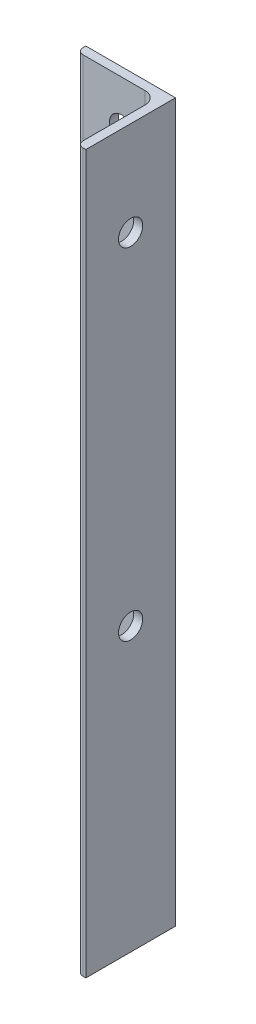
ISO-10303-21;
HEADER;
FILE_DESCRIPTION(('STEP AP214'),'2;1');
FILE_NAME('part.step','',(''),(''),'','','');
FILE_SCHEMA(('AUTOMOTIVE_DESIGN { 1 0 10303 214 1 1 1 1 }'));
ENDSEC;
DATA;
#1=APPLICATION_CONTEXT('core data for automotive mechanical design processes');
#2=APPLICATION_PROTOCOL_DEFINITION('international standard','automotive_design',2000,#1);
#3=PRODUCT_CONTEXT('',#1,'mechanical');
#4=PRODUCT('Part','Part','',(#3));
#5=PRODUCT_RELATED_PRODUCT_CATEGORY('part','',(#4));
#6=PRODUCT_DEFINITION_FORMATION('','',#4);
#7=PRODUCT_DEFINITION_CONTEXT('part definition',#1,'design');
#8=PRODUCT_DEFINITION('design','',#6,#7);
#9=PRODUCT_DEFINITION_SHAPE('','',#8);
#10=(LENGTH_UNIT() NAMED_UNIT(*) SI_UNIT(.MILLI.,.METRE.));
#11=(NAMED_UNIT(*) PLANE_ANGLE_UNIT() SI_UNIT($,.RADIAN.));
#12=(NAMED_UNIT(*) SI_UNIT($,.STERADIAN.) SOLID_ANGLE_UNIT());
#13=UNCERTAINTY_MEASURE_WITH_UNIT(LENGTH_MEASURE(1.E-05),#10,'distance_accuracy_value','');
#14=(GEOMETRIC_REPRESENTATION_CONTEXT(3) GLOBAL_UNCERTAINTY_ASSIGNED_CONTEXT((#13)) GLOBAL_UNIT_ASSIGNED_CONTEXT((#10,
#11,#12)) REPRESENTATION_CONTEXT('',''));
#15=CARTESIAN_POINT('',(0.,0.,0.));
#16=DIRECTION('',(0.,0.,1.));
#17=DIRECTION('',(1.,0.,0.));
#18=AXIS2_PLACEMENT_3D('',#15,#16,#17);
#19=CARTESIAN_POINT('',(0.,200.,0.));
#20=DIRECTION('',(-1.,0.,0.));
#21=DIRECTION('',(0.,0.,1.));
#22=AXIS2_PLACEMENT_3D('',#19,#20,#21);
#23=PLANE('',#22);
#24=CARTESIAN_POINT('',(0.,147.5,25.));
#25=DIRECTION('',(1.,0.,0.));
#26=DIRECTION('',(0.,0.,-1.));
#27=AXIS2_PLACEMENT_3D('',#24,#25,#26);
#28=CIRCLE('',#27,6.75);
#29=CARTESIAN_POINT('',(0.,147.5,18.25));
#30=VERTEX_POINT('',#29);
#31=EDGE_CURVE('E208',#30,#30,#28,.T.);
#32=ORIENTED_EDGE('',*,*,#31,.F.);
#33=EDGE_LOOP('',(#32));
#34=FACE_BOUND('',#33,.T.);
#35=CARTESIAN_POINT('',(0.,-42.5,25.));
#36=DIRECTION('',(1.,0.,0.));
#37=DIRECTION('',(0.,0.,-1.));
#38=AXIS2_PLACEMENT_3D('',#35,#36,#37);
#39=CIRCLE('',#38,6.75);
#40=CARTESIAN_POINT('',(0.,-42.5,18.25));
#41=VERTEX_POINT('',#40);
#42=EDGE_CURVE('E209',#41,#41,#39,.T.);
#43=ORIENTED_EDGE('',*,*,#42,.F.);
#44=EDGE_LOOP('',(#43));
#45=FACE_BOUND('',#44,.T.);
#46=DIRECTION('',(0.,0.,-1.));
#47=VECTOR('',#46,1.);
#48=CARTESIAN_POINT('',(0.,-200.,0.));
#49=LINE('',#48,#47);
#50=CARTESIAN_POINT('',(0.,-200.,50.));
#51=VERTEX_POINT('',#50);
#52=CARTESIAN_POINT('',(0.,-200.,0.));
#53=VERTEX_POINT('',#52);
#54=EDGE_CURVE('E135',#51,#53,#49,.T.);
#55=ORIENTED_EDGE('',*,*,#54,.T.);
#56=DIRECTION('',(0.,-1.,0.));
#57=VECTOR('',#56,1.);
#58=CARTESIAN_POINT('',(0.,200.,0.));
#59=LINE('',#58,#57);
#60=CARTESIAN_POINT('',(0.,200.,0.));
#61=VERTEX_POINT('',#60);
#62=EDGE_CURVE('E11',#61,#53,#59,.T.);
#63=ORIENTED_EDGE('',*,*,#62,.F.);
#64=DIRECTION('',(0.,0.,-1.));
#65=VECTOR('',#64,1.);
#66=CARTESIAN_POINT('',(0.,200.,0.));
#67=LINE('',#66,#65);
#68=CARTESIAN_POINT('',(0.,200.,50.));
#69=VERTEX_POINT('',#68);
#70=EDGE_CURVE('E152',#69,#61,#67,.T.);
#71=ORIENTED_EDGE('',*,*,#70,.F.);
#72=DIRECTION('',(0.,-1.,0.));
#73=VECTOR('',#72,1.);
#74=CARTESIAN_POINT('',(0.,200.,50.));
#75=LINE('',#74,#73);
#76=EDGE_CURVE('E131',#69,#51,#75,.T.);
#77=ORIENTED_EDGE('',*,*,#76,.T.);
#78=EDGE_LOOP('',(#55,#63,#71,#77));
#79=FACE_BOUND('',#78,.T.);
#80=ADVANCED_FACE('F33',(#34,#45,#79),#23,.F.);
#81=CARTESIAN_POINT('',(0.,200.,0.));
#82=DIRECTION('',(0.,0.,1.));
#83=DIRECTION('',(1.,0.,0.));
#84=AXIS2_PLACEMENT_3D('',#81,#82,#83);
#85=PLANE('',#84);
#86=CARTESIAN_POINT('',(-25.,175.,0.));
#87=DIRECTION('',(0.,0.,-1.));
#88=DIRECTION('',(-1.,0.,0.));
#89=AXIS2_PLACEMENT_3D('',#86,#87,#88);
#90=CIRCLE('',#89,6.75000000000002);
#91=CARTESIAN_POINT('',(-31.75,175.,0.));
#92=VERTEX_POINT('',#91);
#93=EDGE_CURVE('E196',#92,#92,#90,.T.);
#94=ORIENTED_EDGE('',*,*,#93,.F.);
#95=EDGE_LOOP('',(#94));
#96=FACE_BOUND('',#95,.T.);
#97=CARTESIAN_POINT('',(-25.,0.,0.));
#98=DIRECTION('',(0.,0.,-1.));
#99=DIRECTION('',(-1.,0.,0.));
#100=AXIS2_PLACEMENT_3D('',#97,#98,#99);
#101=CIRCLE('',#100,6.75000000000002);
#102=CARTESIAN_POINT('',(-31.75,0.,0.));
#103=VERTEX_POINT('',#102);
#104=EDGE_CURVE('E197',#103,#103,#101,.T.);
#105=ORIENTED_EDGE('',*,*,#104,.F.);
#106=EDGE_LOOP('',(#105));
#107=FACE_BOUND('',#106,.T.);
#108=DIRECTION('',(-1.,0.,0.));
#109=VECTOR('',#108,1.);
#110=CARTESIAN_POINT('',(0.,-200.,0.));
#111=LINE('',#110,#109);
#112=CARTESIAN_POINT('',(-50.,-200.,0.));
#113=VERTEX_POINT('',#112);
#114=EDGE_CURVE('E138',#53,#113,#111,.T.);
#115=ORIENTED_EDGE('',*,*,#114,.T.);
#116=DIRECTION('',(0.,-1.,0.));
#117=VECTOR('',#116,1.);
#118=CARTESIAN_POINT('',(-50.,200.,0.));
#119=LINE('',#118,#117);
#120=CARTESIAN_POINT('',(-50.,200.,0.));
#121=VERTEX_POINT('',#120);
#122=EDGE_CURVE('E41',#121,#113,#119,.T.);
#123=ORIENTED_EDGE('',*,*,#122,.F.);
#124=DIRECTION('',(-1.,0.,0.));
#125=VECTOR('',#124,1.);
#126=CARTESIAN_POINT('',(0.,200.,0.));
#127=LINE('',#126,#125);
#128=EDGE_CURVE('E95',#61,#121,#127,.T.);
#129=ORIENTED_EDGE('',*,*,#128,.F.);
#130=ORIENTED_EDGE('',*,*,#62,.T.);
#131=EDGE_LOOP('',(#115,#123,#129,#130));
#132=FACE_BOUND('',#131,.T.);
#133=ADVANCED_FACE('F222',(#96,#107,#132),#85,.F.);
#134=CARTESIAN_POINT('',(-50.,200.,0.));
#135=DIRECTION('',(1.,0.,0.));
#136=DIRECTION('',(0.,0.,-1.));
#137=AXIS2_PLACEMENT_3D('',#134,#135,#136);
#138=PLANE('',#137);
#139=DIRECTION('',(0.,0.,1.));
#140=VECTOR('',#139,1.);
#141=CARTESIAN_POINT('',(-50.,-200.,0.));
#142=LINE('',#141,#140);
#143=CARTESIAN_POINT('',(-50.,-200.,1.50000000000001));
#144=VERTEX_POINT('',#143);
#145=EDGE_CURVE('E141',#113,#144,#142,.T.);
#146=ORIENTED_EDGE('',*,*,#145,.T.);
#147=DIRECTION('',(0.,-1.,0.));
#148=VECTOR('',#147,1.);
#149=CARTESIAN_POINT('',(-50.,200.,1.50000000000001));
#150=LINE('',#149,#148);
#151=CARTESIAN_POINT('',(-50.,200.,1.50000000000001));
#152=VERTEX_POINT('',#151);
#153=EDGE_CURVE('E162',#152,#144,#150,.T.);
#154=ORIENTED_EDGE('',*,*,#153,.F.);
#155=DIRECTION('',(0.,0.,1.));
#156=VECTOR('',#155,1.);
#157=CARTESIAN_POINT('',(-50.,200.,0.));
#158=LINE('',#157,#156);
#159=EDGE_CURVE('E170',#121,#152,#158,.T.);
#160=ORIENTED_EDGE('',*,*,#159,.F.);
#161=ORIENTED_EDGE('',*,*,#122,.T.);
#162=EDGE_LOOP('',(#146,#154,#160,#161));
#163=FACE_BOUND('',#162,.T.);
#164=ADVANCED_FACE('F168',(#163),#138,.F.);
#165=CARTESIAN_POINT('',(-46.5,200.,1.50000000000001));
#166=DIRECTION('',(0.,-1.,0.));
#167=DIRECTION('',(0.,0.,-1.));
#168=AXIS2_PLACEMENT_3D('',#165,#166,#167);
#169=CYLINDRICAL_SURFACE('',#168,3.5);
#170=CARTESIAN_POINT('',(-46.5,-200.,1.50000000000001));
#171=DIRECTION('',(0.,1.,0.));
#172=DIRECTION('',(0.,0.,1.));
#173=AXIS2_PLACEMENT_3D('',#170,#171,#172);
#174=CIRCLE('',#173,3.5);
#175=CARTESIAN_POINT('',(-46.5,-200.,5.00000000000001));
#176=VERTEX_POINT('',#175);
#177=EDGE_CURVE('E143',#144,#176,#174,.T.);
#178=ORIENTED_EDGE('',*,*,#177,.T.);
#179=DIRECTION('',(0.,-1.,0.));
#180=VECTOR('',#179,1.);
#181=CARTESIAN_POINT('',(-46.5,200.,5.00000000000001));
#182=LINE('',#181,#180);
#183=CARTESIAN_POINT('',(-46.5,200.,5.00000000000001));
#184=VERTEX_POINT('',#183);
#185=EDGE_CURVE('E159',#184,#176,#182,.T.);
#186=ORIENTED_EDGE('',*,*,#185,.F.);
#187=CARTESIAN_POINT('',(-46.5,200.,1.50000000000001));
#188=DIRECTION('',(0.,1.,0.));
#189=DIRECTION('',(0.,0.,1.));
#190=AXIS2_PLACEMENT_3D('',#187,#188,#189);
#191=CIRCLE('',#190,3.5);
#192=EDGE_CURVE('E186',#152,#184,#191,.T.);
#193=ORIENTED_EDGE('',*,*,#192,.F.);
#194=ORIENTED_EDGE('',*,*,#153,.T.);
#195=EDGE_LOOP('',(#178,#186,#193,#194));
#196=FACE_BOUND('',#195,.T.);
#197=ADVANCED_FACE('F179',(#196),#169,.T.);
#198=CARTESIAN_POINT('',(-46.5,200.,5.00000000000001));
#199=DIRECTION('',(0.,0.,-1.));
#200=DIRECTION('',(-1.,0.,0.));
#201=AXIS2_PLACEMENT_3D('',#198,#199,#200);
#202=PLANE('',#201);
#203=CARTESIAN_POINT('',(-25.,175.,5.));
#204=DIRECTION('',(0.,0.,-1.));
#205=DIRECTION('',(-1.,0.,0.));
#206=AXIS2_PLACEMENT_3D('',#203,#204,#205);
#207=CIRCLE('',#206,6.75000000000002);
#208=CARTESIAN_POINT('',(-31.75,175.,5.));
#209=VERTEX_POINT('',#208);
#210=EDGE_CURVE('E139',#209,#209,#207,.F.);
#211=ORIENTED_EDGE('',*,*,#210,.F.);
#212=EDGE_LOOP('',(#211));
#213=FACE_BOUND('',#212,.T.);
#214=CARTESIAN_POINT('',(-25.,0.,5.));
#215=DIRECTION('',(0.,0.,-1.));
#216=DIRECTION('',(-1.,0.,0.));
#217=AXIS2_PLACEMENT_3D('',#214,#215,#216);
#218=CIRCLE('',#217,6.75000000000002);
#219=CARTESIAN_POINT('',(-31.75,0.,5.));
#220=VERTEX_POINT('',#219);
#221=EDGE_CURVE('E193',#220,#220,#218,.F.);
#222=ORIENTED_EDGE('',*,*,#221,.F.);
#223=EDGE_LOOP('',(#222));
#224=FACE_BOUND('',#223,.T.);
#225=DIRECTION('',(1.,0.,0.));
#226=VECTOR('',#225,1.);
#227=CARTESIAN_POINT('',(-46.5,-200.,5.00000000000001));
#228=LINE('',#227,#226);
#229=CARTESIAN_POINT('',(-12.,-200.,5.00000000000001));
#230=VERTEX_POINT('',#229);
#231=EDGE_CURVE('E145',#176,#230,#228,.T.);
#232=ORIENTED_EDGE('',*,*,#231,.T.);
#233=DIRECTION('',(0.,-1.,0.));
#234=VECTOR('',#233,1.);
#235=CARTESIAN_POINT('',(-12.,200.,5.00000000000001));
#236=LINE('',#235,#234);
#237=CARTESIAN_POINT('',(-12.,200.,5.00000000000001));
#238=VERTEX_POINT('',#237);
#239=EDGE_CURVE('E156',#238,#230,#236,.T.);
#240=ORIENTED_EDGE('',*,*,#239,.F.);
#241=DIRECTION('',(1.,0.,0.));
#242=VECTOR('',#241,1.);
#243=CARTESIAN_POINT('',(-46.5,200.,5.00000000000001));
#244=LINE('',#243,#242);
#245=EDGE_CURVE('E185',#184,#238,#244,.T.);
#246=ORIENTED_EDGE('',*,*,#245,.F.);
#247=ORIENTED_EDGE('',*,*,#185,.T.);
#248=EDGE_LOOP('',(#232,#240,#246,#247));
#249=FACE_BOUND('',#248,.T.);
#250=ADVANCED_FACE('F183',(#213,#224,#249),#202,.F.);
#251=CARTESIAN_POINT('',(-12.,200.,12.));
#252=DIRECTION('',(0.,-1.,0.));
#253=DIRECTION('',(0.,0.,-1.));
#254=AXIS2_PLACEMENT_3D('',#251,#252,#253);
#255=CYLINDRICAL_SURFACE('',#254,7.);
#256=CARTESIAN_POINT('',(-12.,-200.,12.));
#257=DIRECTION('',(0.,-1.,0.));
#258=DIRECTION('',(0.,0.,-1.));
#259=AXIS2_PLACEMENT_3D('',#256,#257,#258);
#260=CIRCLE('',#259,7.);
#261=CARTESIAN_POINT('',(-5.,-200.,12.));
#262=VERTEX_POINT('',#261);
#263=EDGE_CURVE('E147',#230,#262,#260,.T.);
#264=ORIENTED_EDGE('',*,*,#263,.T.);
#265=DIRECTION('',(0.,-1.,0.));
#266=VECTOR('',#265,1.);
#267=CARTESIAN_POINT('',(-5.,200.,12.));
#268=LINE('',#267,#266);
#269=CARTESIAN_POINT('',(-5.,200.,12.));
#270=VERTEX_POINT('',#269);
#271=EDGE_CURVE('E126',#270,#262,#268,.T.);
#272=ORIENTED_EDGE('',*,*,#271,.F.);
#273=CARTESIAN_POINT('',(-12.,200.,12.));
#274=DIRECTION('',(0.,-1.,0.));
#275=DIRECTION('',(0.,0.,-1.));
#276=AXIS2_PLACEMENT_3D('',#273,#274,#275);
#277=CIRCLE('',#276,7.);
#278=EDGE_CURVE('E117',#238,#270,#277,.T.);
#279=ORIENTED_EDGE('',*,*,#278,.F.);
#280=ORIENTED_EDGE('',*,*,#239,.T.);
#281=EDGE_LOOP('',(#264,#272,#279,#280));
#282=FACE_BOUND('',#281,.T.);
#283=ADVANCED_FACE('F228',(#282),#255,.F.);
#284=CARTESIAN_POINT('',(-4.99999999999999,200.,46.5));
#285=DIRECTION('',(1.,0.,0.));
#286=DIRECTION('',(0.,0.,-1.));
#287=AXIS2_PLACEMENT_3D('',#284,#285,#286);
#288=PLANE('',#287);
#289=CARTESIAN_POINT('',(-5.,147.5,25.));
#290=DIRECTION('',(1.,0.,0.));
#291=DIRECTION('',(0.,0.,-1.));
#292=AXIS2_PLACEMENT_3D('',#289,#290,#291);
#293=CIRCLE('',#292,6.75);
#294=CARTESIAN_POINT('',(-5.,147.5,18.25));
#295=VERTEX_POINT('',#294);
#296=EDGE_CURVE('E200',#295,#295,#293,.F.);
#297=ORIENTED_EDGE('',*,*,#296,.F.);
#298=EDGE_LOOP('',(#297));
#299=FACE_BOUND('',#298,.T.);
#300=CARTESIAN_POINT('',(-5.,-42.5,25.));
#301=DIRECTION('',(1.,0.,0.));
#302=DIRECTION('',(0.,0.,-1.));
#303=AXIS2_PLACEMENT_3D('',#300,#301,#302);
#304=CIRCLE('',#303,6.75);
#305=CARTESIAN_POINT('',(-5.,-42.5,18.25));
#306=VERTEX_POINT('',#305);
#307=EDGE_CURVE('E205',#306,#306,#304,.F.);
#308=ORIENTED_EDGE('',*,*,#307,.F.);
#309=EDGE_LOOP('',(#308));
#310=FACE_BOUND('',#309,.T.);
#311=DIRECTION('',(0.,0.,1.));
#312=VECTOR('',#311,1.);
#313=CARTESIAN_POINT('',(-4.99999999999999,-200.,46.5));
#314=LINE('',#313,#312);
#315=CARTESIAN_POINT('',(-4.99999999999999,-200.,46.5));
#316=VERTEX_POINT('',#315);
#317=EDGE_CURVE('E125',#262,#316,#314,.T.);
#318=ORIENTED_EDGE('',*,*,#317,.T.);
#319=DIRECTION('',(0.,-1.,0.));
#320=VECTOR('',#319,1.);
#321=CARTESIAN_POINT('',(-4.99999999999999,200.,46.5));
#322=LINE('',#321,#320);
#323=CARTESIAN_POINT('',(-4.99999999999999,200.,46.5));
#324=VERTEX_POINT('',#323);
#325=EDGE_CURVE('E122',#324,#316,#322,.T.);
#326=ORIENTED_EDGE('',*,*,#325,.F.);
#327=DIRECTION('',(0.,0.,1.));
#328=VECTOR('',#327,1.);
#329=CARTESIAN_POINT('',(-4.99999999999999,200.,46.5));
#330=LINE('',#329,#328);
#331=EDGE_CURVE('E111',#270,#324,#330,.T.);
#332=ORIENTED_EDGE('',*,*,#331,.F.);
#333=ORIENTED_EDGE('',*,*,#271,.T.);
#334=EDGE_LOOP('',(#318,#326,#332,#333));
#335=FACE_BOUND('',#334,.T.);
#336=ADVANCED_FACE('F123',(#299,#310,#335),#288,.F.);
#337=CARTESIAN_POINT('',(-1.49999999999999,200.,46.5));
#338=DIRECTION('',(0.,-1.,0.));
#339=DIRECTION('',(0.,0.,-1.));
#340=AXIS2_PLACEMENT_3D('',#337,#338,#339);
#341=CYLINDRICAL_SURFACE('',#340,3.5);
#342=CARTESIAN_POINT('',(-1.49999999999999,-200.,46.5));
#343=DIRECTION('',(0.,1.,0.));
#344=DIRECTION('',(0.,0.,-1.));
#345=AXIS2_PLACEMENT_3D('',#342,#343,#344);
#346=CIRCLE('',#345,3.5);
#347=CARTESIAN_POINT('',(-1.49999999999999,-200.,50.));
#348=VERTEX_POINT('',#347);
#349=EDGE_CURVE('E81',#316,#348,#346,.T.);
#350=ORIENTED_EDGE('',*,*,#349,.T.);
#351=DIRECTION('',(0.,-1.,0.));
#352=VECTOR('',#351,1.);
#353=CARTESIAN_POINT('',(-1.49999999999999,200.,50.));
#354=LINE('',#353,#352);
#355=CARTESIAN_POINT('',(-1.49999999999999,200.,50.));
#356=VERTEX_POINT('',#355);
#357=EDGE_CURVE('E127',#356,#348,#354,.T.);
#358=ORIENTED_EDGE('',*,*,#357,.F.);
#359=CARTESIAN_POINT('',(-1.49999999999999,200.,46.5));
#360=DIRECTION('',(0.,1.,0.));
#361=DIRECTION('',(0.,0.,-1.));
#362=AXIS2_PLACEMENT_3D('',#359,#360,#361);
#363=CIRCLE('',#362,3.5);
#364=EDGE_CURVE('E115',#324,#356,#363,.T.);
#365=ORIENTED_EDGE('',*,*,#364,.F.);
#366=ORIENTED_EDGE('',*,*,#325,.T.);
#367=EDGE_LOOP('',(#350,#358,#365,#366));
#368=FACE_BOUND('',#367,.T.);
#369=ADVANCED_FACE('F129',(#368),#341,.T.);
#370=CARTESIAN_POINT('',(0.,200.,50.));
#371=DIRECTION('',(0.,0.,-1.));
#372=DIRECTION('',(-1.,0.,0.));
#373=AXIS2_PLACEMENT_3D('',#370,#371,#372);
#374=PLANE('',#373);
#375=DIRECTION('',(1.,0.,0.));
#376=VECTOR('',#375,1.);
#377=CARTESIAN_POINT('',(0.,-200.,50.));
#378=LINE('',#377,#376);
#379=EDGE_CURVE('E87',#348,#51,#378,.T.);
#380=ORIENTED_EDGE('',*,*,#379,.T.);
#381=ORIENTED_EDGE('',*,*,#76,.F.);
#382=DIRECTION('',(1.,0.,0.));
#383=VECTOR('',#382,1.);
#384=CARTESIAN_POINT('',(0.,200.,50.));
#385=LINE('',#384,#383);
#386=EDGE_CURVE('E49',#356,#69,#385,.T.);
#387=ORIENTED_EDGE('',*,*,#386,.F.);
#388=ORIENTED_EDGE('',*,*,#357,.T.);
#389=EDGE_LOOP('',(#380,#381,#387,#388));
#390=FACE_BOUND('',#389,.T.);
#391=ADVANCED_FACE('F270',(#390),#374,.F.);
#392=CARTESIAN_POINT('',(-1.49999999999999,200.,46.5));
#393=DIRECTION('',(0.,-1.,0.));
#394=DIRECTION('',(0.,0.,-1.));
#395=AXIS2_PLACEMENT_3D('',#392,#393,#394);
#396=PLANE('',#395);
#397=ORIENTED_EDGE('',*,*,#70,.T.);
#398=ORIENTED_EDGE('',*,*,#128,.T.);
#399=ORIENTED_EDGE('',*,*,#159,.T.);
#400=ORIENTED_EDGE('',*,*,#192,.T.);
#401=ORIENTED_EDGE('',*,*,#245,.T.);
#402=ORIENTED_EDGE('',*,*,#278,.T.);
#403=ORIENTED_EDGE('',*,*,#331,.T.);
#404=ORIENTED_EDGE('',*,*,#364,.T.);
#405=ORIENTED_EDGE('',*,*,#386,.T.);
#406=EDGE_LOOP('',(#397,#398,#399,#400,#401,#402,#403,#404,#405));
#407=FACE_BOUND('',#406,.T.);
#408=ADVANCED_FACE('F113',(#407),#396,.F.);
#409=CARTESIAN_POINT('',(-1.49999999999999,-200.,46.5));
#410=DIRECTION('',(0.,-1.,0.));
#411=DIRECTION('',(0.,0.,-1.));
#412=AXIS2_PLACEMENT_3D('',#409,#410,#411);
#413=PLANE('',#412);
#414=ORIENTED_EDGE('',*,*,#54,.F.);
#415=ORIENTED_EDGE('',*,*,#379,.F.);
#416=ORIENTED_EDGE('',*,*,#349,.F.);
#417=ORIENTED_EDGE('',*,*,#317,.F.);
#418=ORIENTED_EDGE('',*,*,#263,.F.);
#419=ORIENTED_EDGE('',*,*,#231,.F.);
#420=ORIENTED_EDGE('',*,*,#177,.F.);
#421=ORIENTED_EDGE('',*,*,#145,.F.);
#422=ORIENTED_EDGE('',*,*,#114,.F.);
#423=EDGE_LOOP('',(#414,#415,#416,#417,#418,#419,#420,#421,#422));
#424=FACE_BOUND('',#423,.T.);
#425=ADVANCED_FACE('F174',(#424),#413,.T.);
#426=CARTESIAN_POINT('',(-25.,0.,50.001));
#427=DIRECTION('',(0.,0.,-1.));
#428=DIRECTION('',(-1.,0.,0.));
#429=AXIS2_PLACEMENT_3D('',#426,#427,#428);
#430=CYLINDRICAL_SURFACE('',#429,6.75000000000002);
#431=ORIENTED_EDGE('',*,*,#104,.T.);
#432=EDGE_LOOP('',(#431));
#433=FACE_BOUND('',#432,.T.);
#434=ORIENTED_EDGE('',*,*,#221,.T.);
#435=EDGE_LOOP('',(#434));
#436=FACE_BOUND('',#435,.T.);
#437=ADVANCED_FACE('F252',(#433,#436),#430,.F.);
#438=CARTESIAN_POINT('',(-25.,175.,50.001));
#439=DIRECTION('',(0.,0.,-1.));
#440=DIRECTION('',(-1.,0.,0.));
#441=AXIS2_PLACEMENT_3D('',#438,#439,#440);
#442=CYLINDRICAL_SURFACE('',#441,6.75000000000002);
#443=ORIENTED_EDGE('',*,*,#93,.T.);
#444=EDGE_LOOP('',(#443));
#445=FACE_BOUND('',#444,.T.);
#446=ORIENTED_EDGE('',*,*,#210,.T.);
#447=EDGE_LOOP('',(#446));
#448=FACE_BOUND('',#447,.T.);
#449=ADVANCED_FACE('F255',(#445,#448),#442,.F.);
#450=CARTESIAN_POINT('',(-50.001,-42.5,25.));
#451=DIRECTION('',(1.,0.,0.));
#452=DIRECTION('',(0.,0.,-1.));
#453=AXIS2_PLACEMENT_3D('',#450,#451,#452);
#454=CYLINDRICAL_SURFACE('',#453,6.75);
#455=ORIENTED_EDGE('',*,*,#42,.T.);
#456=EDGE_LOOP('',(#455));
#457=FACE_BOUND('',#456,.T.);
#458=ORIENTED_EDGE('',*,*,#307,.T.);
#459=EDGE_LOOP('',(#458));
#460=FACE_BOUND('',#459,.T.);
#461=ADVANCED_FACE('F263',(#457,#460),#454,.F.);
#462=CARTESIAN_POINT('',(-50.001,147.5,25.));
#463=DIRECTION('',(1.,0.,0.));
#464=DIRECTION('',(0.,0.,-1.));
#465=AXIS2_PLACEMENT_3D('',#462,#463,#464);
#466=CYLINDRICAL_SURFACE('',#465,6.75);
#467=ORIENTED_EDGE('',*,*,#31,.T.);
#468=EDGE_LOOP('',(#467));
#469=FACE_BOUND('',#468,.T.);
#470=ORIENTED_EDGE('',*,*,#296,.T.);
#471=EDGE_LOOP('',(#470));
#472=FACE_BOUND('',#471,.T.);
#473=ADVANCED_FACE('F217',(#469,#472),#466,.F.);
#474=CLOSED_SHELL('',(#80,#133,#164,#197,#250,#283,#336,#369,#391,#408,#425,#437,#449,#461,#473));
#475=MANIFOLD_SOLID_BREP('B2',#474);
#476=ADVANCED_BREP_SHAPE_REPRESENTATION('',(#18,#475),#14);
#477=SHAPE_DEFINITION_REPRESENTATION(#9,#476);
ENDSEC;
END-ISO-10303-21;
